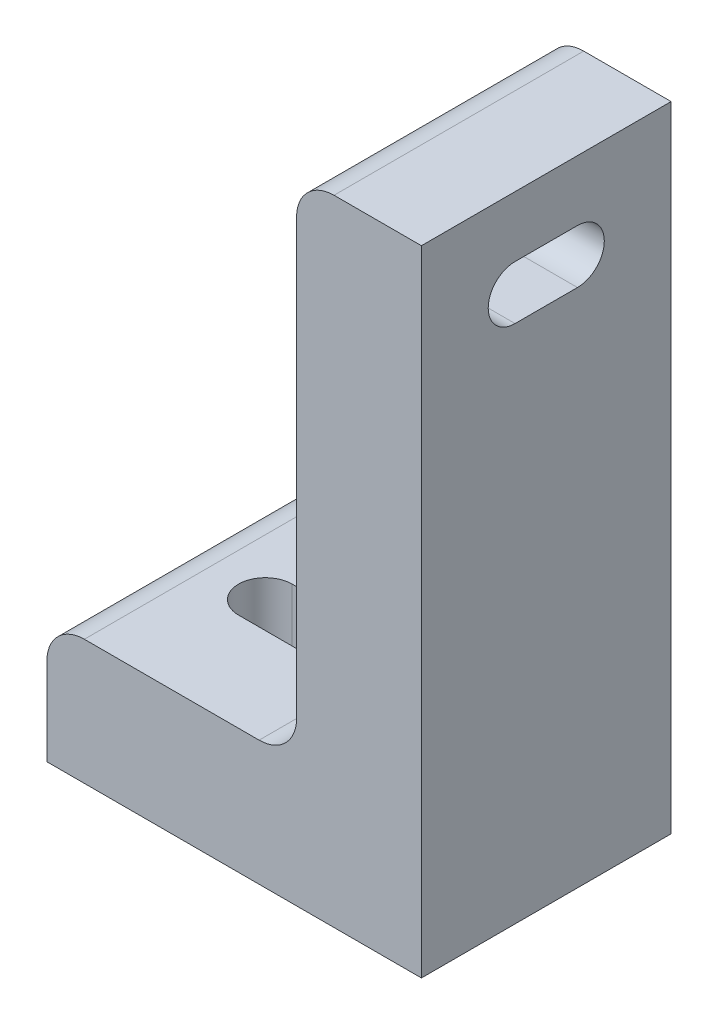
ISO-10303-21;
HEADER;
FILE_DESCRIPTION(('STEP AP214'),'2;1');
FILE_NAME('part.step','',(''),(''),'','','');
FILE_SCHEMA(('AUTOMOTIVE_DESIGN { 1 0 10303 214 1 1 1 1 }'));
ENDSEC;
DATA;
#1=APPLICATION_CONTEXT('core data for automotive mechanical design processes');
#2=APPLICATION_PROTOCOL_DEFINITION('international standard','automotive_design',2000,#1);
#3=PRODUCT_CONTEXT('',#1,'mechanical');
#4=PRODUCT('Part','Part','',(#3));
#5=PRODUCT_RELATED_PRODUCT_CATEGORY('part','',(#4));
#6=PRODUCT_DEFINITION_FORMATION('','',#4);
#7=PRODUCT_DEFINITION_CONTEXT('part definition',#1,'design');
#8=PRODUCT_DEFINITION('design','',#6,#7);
#9=PRODUCT_DEFINITION_SHAPE('','',#8);
#10=(LENGTH_UNIT() NAMED_UNIT(*) SI_UNIT(.MILLI.,.METRE.));
#11=(NAMED_UNIT(*) PLANE_ANGLE_UNIT() SI_UNIT($,.RADIAN.));
#12=(NAMED_UNIT(*) SI_UNIT($,.STERADIAN.) SOLID_ANGLE_UNIT());
#13=UNCERTAINTY_MEASURE_WITH_UNIT(LENGTH_MEASURE(1.E-05),#10,'distance_accuracy_value','');
#14=(GEOMETRIC_REPRESENTATION_CONTEXT(3) GLOBAL_UNCERTAINTY_ASSIGNED_CONTEXT((#13)) GLOBAL_UNIT_ASSIGNED_CONTEXT((#10,
#11,#12)) REPRESENTATION_CONTEXT('',''));
#15=CARTESIAN_POINT('',(0.,0.,0.));
#16=DIRECTION('',(0.,0.,1.));
#17=DIRECTION('',(1.,0.,0.));
#18=AXIS2_PLACEMENT_3D('',#15,#16,#17);
#19=CARTESIAN_POINT('',(0.,0.,20.));
#20=DIRECTION('',(-1.,0.,0.));
#21=DIRECTION('',(0.,0.,1.));
#22=AXIS2_PLACEMENT_3D('',#19,#20,#21);
#23=PLANE('',#22);
#24=DIRECTION('',(0.,1.,0.));
#25=VECTOR('',#24,1.);
#26=CARTESIAN_POINT('',(0.,0.,0.));
#27=LINE('',#26,#25);
#28=CARTESIAN_POINT('',(0.,0.,0.));
#29=VERTEX_POINT('',#28);
#30=CARTESIAN_POINT('',(0.,50.8,0.));
#31=VERTEX_POINT('',#30);
#32=EDGE_CURVE('E394',#29,#31,#27,.T.);
#33=ORIENTED_EDGE('',*,*,#32,.T.);
#34=DIRECTION('',(0.,0.,-1.));
#35=VECTOR('',#34,1.);
#36=CARTESIAN_POINT('',(0.,50.8,20.));
#37=LINE('',#36,#35);
#38=CARTESIAN_POINT('',(0.,50.8,20.));
#39=VERTEX_POINT('',#38);
#40=EDGE_CURVE('E387',#39,#31,#37,.T.);
#41=ORIENTED_EDGE('',*,*,#40,.F.);
#42=DIRECTION('',(0.,1.,0.));
#43=VECTOR('',#42,1.);
#44=CARTESIAN_POINT('',(0.,0.,20.));
#45=LINE('',#44,#43);
#46=CARTESIAN_POINT('',(0.,0.,20.));
#47=VERTEX_POINT('',#46);
#48=EDGE_CURVE('E379',#47,#39,#45,.T.);
#49=ORIENTED_EDGE('',*,*,#48,.F.);
#50=DIRECTION('',(0.,0.,-1.));
#51=VECTOR('',#50,1.);
#52=CARTESIAN_POINT('',(0.,0.,20.));
#53=LINE('',#52,#51);
#54=EDGE_CURVE('E403',#47,#29,#53,.T.);
#55=ORIENTED_EDGE('',*,*,#54,.T.);
#56=EDGE_LOOP('',(#33,#41,#49,#55));
#57=FACE_BOUND('',#56,.T.);
#58=DIRECTION('',(0.,0.,1.));
#59=VECTOR('',#58,1.);
#60=CARTESIAN_POINT('',(0.,45.95,20.));
#61=LINE('',#60,#59);
#62=CARTESIAN_POINT('',(0.,45.95,7.5));
#63=VERTEX_POINT('',#62);
#64=CARTESIAN_POINT('',(0.,45.95,12.5));
#65=VERTEX_POINT('',#64);
#66=EDGE_CURVE('E414',#63,#65,#61,.T.);
#67=ORIENTED_EDGE('',*,*,#66,.F.);
#68=CARTESIAN_POINT('',(0.,43.8,7.5));
#69=DIRECTION('',(-1.,0.,0.));
#70=DIRECTION('',(0.,0.,1.));
#71=AXIS2_PLACEMENT_3D('',#68,#69,#70);
#72=CIRCLE('',#71,2.15);
#73=CARTESIAN_POINT('',(0.,41.65,7.5));
#74=VERTEX_POINT('',#73);
#75=EDGE_CURVE('E411',#63,#74,#72,.T.);
#76=ORIENTED_EDGE('',*,*,#75,.T.);
#77=DIRECTION('',(0.,0.,1.));
#78=VECTOR('',#77,1.);
#79=CARTESIAN_POINT('',(0.,41.65,20.));
#80=LINE('',#79,#78);
#81=CARTESIAN_POINT('',(0.,41.65,12.5));
#82=VERTEX_POINT('',#81);
#83=EDGE_CURVE('E408',#74,#82,#80,.T.);
#84=ORIENTED_EDGE('',*,*,#83,.T.);
#85=CARTESIAN_POINT('',(0.,43.8,12.5));
#86=DIRECTION('',(-1.,0.,0.));
#87=DIRECTION('',(0.,0.,1.));
#88=AXIS2_PLACEMENT_3D('',#85,#86,#87);
#89=CIRCLE('',#88,2.15);
#90=EDGE_CURVE('E368',#82,#65,#89,.T.);
#91=ORIENTED_EDGE('',*,*,#90,.T.);
#92=EDGE_LOOP('',(#67,#76,#84,#91));
#93=FACE_BOUND('',#92,.T.);
#94=ADVANCED_FACE('F191',(#57,#93),#23,.F.);
#95=CARTESIAN_POINT('',(-10.,10.,20.));
#96=DIRECTION('',(0.,-1.,0.));
#97=DIRECTION('',(1.,0.,0.));
#98=AXIS2_PLACEMENT_3D('',#95,#96,#97);
#99=PLANE('',#98);
#100=CARTESIAN_POINT('',(-22.5,10.,10.));
#101=DIRECTION('',(0.,1.,0.));
#102=DIRECTION('',(0.,0.,1.));
#103=AXIS2_PLACEMENT_3D('',#100,#101,#102);
#104=CIRCLE('',#103,2.14999999999999);
#105=CARTESIAN_POINT('',(-22.5,10.,7.85000000000001));
#106=VERTEX_POINT('',#105);
#107=CARTESIAN_POINT('',(-22.5,10.,12.15));
#108=VERTEX_POINT('',#107);
#109=EDGE_CURVE('E335',#106,#108,#104,.T.);
#110=ORIENTED_EDGE('',*,*,#109,.F.);
#111=DIRECTION('',(1.,0.,0.));
#112=VECTOR('',#111,1.);
#113=CARTESIAN_POINT('',(-22.5,10.,7.85000000000001));
#114=LINE('',#113,#112);
#115=CARTESIAN_POINT('',(-17.5,10.,7.85000000000001));
#116=VERTEX_POINT('',#115);
#117=EDGE_CURVE('E316',#106,#116,#114,.T.);
#118=ORIENTED_EDGE('',*,*,#117,.T.);
#119=CARTESIAN_POINT('',(-17.5,10.,10.));
#120=DIRECTION('',(0.,1.,0.));
#121=DIRECTION('',(0.,0.,1.));
#122=AXIS2_PLACEMENT_3D('',#119,#120,#121);
#123=CIRCLE('',#122,2.14999999999999);
#124=CARTESIAN_POINT('',(-17.5,10.,12.15));
#125=VERTEX_POINT('',#124);
#126=EDGE_CURVE('E323',#125,#116,#123,.T.);
#127=ORIENTED_EDGE('',*,*,#126,.F.);
#128=DIRECTION('',(1.,0.,0.));
#129=VECTOR('',#128,1.);
#130=CARTESIAN_POINT('',(-22.5,10.,12.15));
#131=LINE('',#130,#129);
#132=EDGE_CURVE('E336',#108,#125,#131,.T.);
#133=ORIENTED_EDGE('',*,*,#132,.F.);
#134=EDGE_LOOP('',(#110,#118,#127,#133));
#135=FACE_BOUND('',#134,.T.);
#136=DIRECTION('',(-1.,0.,0.));
#137=VECTOR('',#136,1.);
#138=CARTESIAN_POINT('',(-10.,10.,20.));
#139=LINE('',#138,#137);
#140=CARTESIAN_POINT('',(-13.,10.,20.));
#141=VERTEX_POINT('',#140);
#142=CARTESIAN_POINT('',(-27.,10.,20.));
#143=VERTEX_POINT('',#142);
#144=EDGE_CURVE('E372',#141,#143,#139,.T.);
#145=ORIENTED_EDGE('',*,*,#144,.F.);
#146=DIRECTION('',(0.,0.,-1.));
#147=VECTOR('',#146,1.);
#148=CARTESIAN_POINT('',(-13.,10.,20.));
#149=LINE('',#148,#147);
#150=CARTESIAN_POINT('',(-13.,10.,0.));
#151=VERTEX_POINT('',#150);
#152=EDGE_CURVE('E437',#141,#151,#149,.T.);
#153=ORIENTED_EDGE('',*,*,#152,.T.);
#154=DIRECTION('',(-1.,0.,0.));
#155=VECTOR('',#154,1.);
#156=CARTESIAN_POINT('',(-10.,10.,0.));
#157=LINE('',#156,#155);
#158=CARTESIAN_POINT('',(-27.,10.,0.));
#159=VERTEX_POINT('',#158);
#160=EDGE_CURVE('E371',#151,#159,#157,.T.);
#161=ORIENTED_EDGE('',*,*,#160,.T.);
#162=DIRECTION('',(0.,0.,-1.));
#163=VECTOR('',#162,1.);
#164=CARTESIAN_POINT('',(-27.,10.,20.));
#165=LINE('',#164,#163);
#166=EDGE_CURVE('E214',#159,#143,#165,.F.);
#167=ORIENTED_EDGE('',*,*,#166,.T.);
#168=EDGE_LOOP('',(#145,#153,#161,#167));
#169=FACE_BOUND('',#168,.T.);
#170=ADVANCED_FACE('F333',(#135,#169),#99,.F.);
#171=CARTESIAN_POINT('',(-30.,0.,20.));
#172=DIRECTION('',(-1.,0.,0.));
#173=DIRECTION('',(0.,0.,1.));
#174=AXIS2_PLACEMENT_3D('',#171,#172,#173);
#175=PLANE('',#174);
#176=DIRECTION('',(0.,1.,0.));
#177=VECTOR('',#176,1.);
#178=CARTESIAN_POINT('',(-30.,0.,20.));
#179=LINE('',#178,#177);
#180=CARTESIAN_POINT('',(-30.,0.,20.));
#181=VERTEX_POINT('',#180);
#182=CARTESIAN_POINT('',(-30.,7.,20.));
#183=VERTEX_POINT('',#182);
#184=EDGE_CURVE('E374',#181,#183,#179,.T.);
#185=ORIENTED_EDGE('',*,*,#184,.T.);
#186=DIRECTION('',(0.,0.,-1.));
#187=VECTOR('',#186,1.);
#188=CARTESIAN_POINT('',(-30.,7.,0.));
#189=LINE('',#188,#187);
#190=CARTESIAN_POINT('',(-30.,7.,0.));
#191=VERTEX_POINT('',#190);
#192=EDGE_CURVE('E440',#183,#191,#189,.T.);
#193=ORIENTED_EDGE('',*,*,#192,.T.);
#194=DIRECTION('',(0.,1.,0.));
#195=VECTOR('',#194,1.);
#196=CARTESIAN_POINT('',(-30.,0.,0.));
#197=LINE('',#196,#195);
#198=CARTESIAN_POINT('',(-30.,0.,0.));
#199=VERTEX_POINT('',#198);
#200=EDGE_CURVE('E389',#199,#191,#197,.T.);
#201=ORIENTED_EDGE('',*,*,#200,.F.);
#202=DIRECTION('',(0.,0.,-1.));
#203=VECTOR('',#202,1.);
#204=CARTESIAN_POINT('',(-30.,0.,20.));
#205=LINE('',#204,#203);
#206=EDGE_CURVE('E406',#181,#199,#205,.T.);
#207=ORIENTED_EDGE('',*,*,#206,.F.);
#208=EDGE_LOOP('',(#185,#193,#201,#207));
#209=FACE_BOUND('',#208,.T.);
#210=ADVANCED_FACE('F461',(#209),#175,.T.);
#211=CARTESIAN_POINT('',(-30.,0.,20.));
#212=DIRECTION('',(0.,1.,0.));
#213=DIRECTION('',(0.,0.,1.));
#214=AXIS2_PLACEMENT_3D('',#211,#212,#213);
#215=PLANE('',#214);
#216=DIRECTION('',(1.,0.,0.));
#217=VECTOR('',#216,1.);
#218=CARTESIAN_POINT('',(-30.,0.,12.15));
#219=LINE('',#218,#217);
#220=CARTESIAN_POINT('',(-22.5,0.,12.15));
#221=VERTEX_POINT('',#220);
#222=CARTESIAN_POINT('',(-17.5,0.,12.15));
#223=VERTEX_POINT('',#222);
#224=EDGE_CURVE('E417',#221,#223,#219,.T.);
#225=ORIENTED_EDGE('',*,*,#224,.T.);
#226=CARTESIAN_POINT('',(-17.5,0.,10.));
#227=DIRECTION('',(0.,1.,0.));
#228=DIRECTION('',(0.,0.,1.));
#229=AXIS2_PLACEMENT_3D('',#226,#227,#228);
#230=CIRCLE('',#229,2.14999999999999);
#231=CARTESIAN_POINT('',(-17.5,0.,7.85000000000001));
#232=VERTEX_POINT('',#231);
#233=EDGE_CURVE('E420',#223,#232,#230,.T.);
#234=ORIENTED_EDGE('',*,*,#233,.T.);
#235=DIRECTION('',(-1.,0.,0.));
#236=VECTOR('',#235,1.);
#237=CARTESIAN_POINT('',(-30.,0.,7.85000000000002));
#238=LINE('',#237,#236);
#239=CARTESIAN_POINT('',(-22.5,0.,7.85000000000001));
#240=VERTEX_POINT('',#239);
#241=EDGE_CURVE('E319',#232,#240,#238,.T.);
#242=ORIENTED_EDGE('',*,*,#241,.T.);
#243=CARTESIAN_POINT('',(-22.5,0.,10.));
#244=DIRECTION('',(0.,1.,0.));
#245=DIRECTION('',(0.,0.,1.));
#246=AXIS2_PLACEMENT_3D('',#243,#244,#245);
#247=CIRCLE('',#246,2.14999999999999);
#248=EDGE_CURVE('E345',#240,#221,#247,.T.);
#249=ORIENTED_EDGE('',*,*,#248,.T.);
#250=EDGE_LOOP('',(#225,#234,#242,#249));
#251=FACE_BOUND('',#250,.T.);
#252=DIRECTION('',(1.,0.,0.));
#253=VECTOR('',#252,1.);
#254=CARTESIAN_POINT('',(-30.,0.,0.));
#255=LINE('',#254,#253);
#256=EDGE_CURVE('E392',#199,#29,#255,.T.);
#257=ORIENTED_EDGE('',*,*,#256,.T.);
#258=ORIENTED_EDGE('',*,*,#54,.F.);
#259=DIRECTION('',(1.,0.,0.));
#260=VECTOR('',#259,1.);
#261=CARTESIAN_POINT('',(-30.,0.,20.));
#262=LINE('',#261,#260);
#263=EDGE_CURVE('E377',#181,#47,#262,.T.);
#264=ORIENTED_EDGE('',*,*,#263,.F.);
#265=ORIENTED_EDGE('',*,*,#206,.T.);
#266=EDGE_LOOP('',(#257,#258,#264,#265));
#267=FACE_BOUND('',#266,.T.);
#268=ADVANCED_FACE('F466',(#251,#267),#215,.F.);
#269=CARTESIAN_POINT('',(-10.,50.8,20.));
#270=DIRECTION('',(0.,1.,0.));
#271=DIRECTION('',(0.,0.,1.));
#272=AXIS2_PLACEMENT_3D('',#269,#270,#271);
#273=PLANE('',#272);
#274=DIRECTION('',(1.,0.,0.));
#275=VECTOR('',#274,1.);
#276=CARTESIAN_POINT('',(-10.,50.8,0.));
#277=LINE('',#276,#275);
#278=CARTESIAN_POINT('',(-7.,50.8,0.));
#279=VERTEX_POINT('',#278);
#280=EDGE_CURVE('E397',#279,#31,#277,.T.);
#281=ORIENTED_EDGE('',*,*,#280,.F.);
#282=DIRECTION('',(0.,0.,-1.));
#283=VECTOR('',#282,1.);
#284=CARTESIAN_POINT('',(-7.,50.8,20.));
#285=LINE('',#284,#283);
#286=CARTESIAN_POINT('',(-7.,50.8,20.));
#287=VERTEX_POINT('',#286);
#288=EDGE_CURVE('E431',#279,#287,#285,.F.);
#289=ORIENTED_EDGE('',*,*,#288,.T.);
#290=DIRECTION('',(1.,0.,0.));
#291=VECTOR('',#290,1.);
#292=CARTESIAN_POINT('',(-10.,50.8,20.));
#293=LINE('',#292,#291);
#294=EDGE_CURVE('E382',#287,#39,#293,.T.);
#295=ORIENTED_EDGE('',*,*,#294,.T.);
#296=ORIENTED_EDGE('',*,*,#40,.T.);
#297=EDGE_LOOP('',(#281,#289,#295,#296));
#298=FACE_BOUND('',#297,.T.);
#299=ADVANCED_FACE('F478',(#298),#273,.T.);
#300=CARTESIAN_POINT('',(-10.,10.,20.));
#301=DIRECTION('',(-1.,0.,0.));
#302=DIRECTION('',(0.,0.,1.));
#303=AXIS2_PLACEMENT_3D('',#300,#301,#302);
#304=PLANE('',#303);
#305=DIRECTION('',(0.,0.,1.));
#306=VECTOR('',#305,1.);
#307=CARTESIAN_POINT('',(-10.,41.65,7.5));
#308=LINE('',#307,#306);
#309=CARTESIAN_POINT('',(-10.,41.65,7.5));
#310=VERTEX_POINT('',#309);
#311=CARTESIAN_POINT('',(-10.,41.65,12.5));
#312=VERTEX_POINT('',#311);
#313=EDGE_CURVE('E348',#310,#312,#308,.T.);
#314=ORIENTED_EDGE('',*,*,#313,.F.);
#315=CARTESIAN_POINT('',(-10.,43.8,7.5));
#316=DIRECTION('',(-1.,0.,0.));
#317=DIRECTION('',(0.,0.,1.));
#318=AXIS2_PLACEMENT_3D('',#315,#316,#317);
#319=CIRCLE('',#318,2.15);
#320=CARTESIAN_POINT('',(-10.,45.95,7.5));
#321=VERTEX_POINT('',#320);
#322=EDGE_CURVE('E356',#321,#310,#319,.T.);
#323=ORIENTED_EDGE('',*,*,#322,.F.);
#324=DIRECTION('',(0.,0.,1.));
#325=VECTOR('',#324,1.);
#326=CARTESIAN_POINT('',(-10.,45.95,7.5));
#327=LINE('',#326,#325);
#328=CARTESIAN_POINT('',(-10.,45.95,12.5));
#329=VERTEX_POINT('',#328);
#330=EDGE_CURVE('E350',#321,#329,#327,.T.);
#331=ORIENTED_EDGE('',*,*,#330,.T.);
#332=CARTESIAN_POINT('',(-10.,43.8,12.5));
#333=DIRECTION('',(-1.,0.,0.));
#334=DIRECTION('',(0.,0.,1.));
#335=AXIS2_PLACEMENT_3D('',#332,#333,#334);
#336=CIRCLE('',#335,2.15);
#337=EDGE_CURVE('E364',#312,#329,#336,.T.);
#338=ORIENTED_EDGE('',*,*,#337,.F.);
#339=EDGE_LOOP('',(#314,#323,#331,#338));
#340=FACE_BOUND('',#339,.T.);
#341=DIRECTION('',(0.,1.,0.));
#342=VECTOR('',#341,1.);
#343=CARTESIAN_POINT('',(-10.,10.,20.));
#344=LINE('',#343,#342);
#345=CARTESIAN_POINT('',(-10.,13.,20.));
#346=VERTEX_POINT('',#345);
#347=CARTESIAN_POINT('',(-10.,47.8,20.));
#348=VERTEX_POINT('',#347);
#349=EDGE_CURVE('E384',#346,#348,#344,.T.);
#350=ORIENTED_EDGE('',*,*,#349,.T.);
#351=DIRECTION('',(0.,0.,-1.));
#352=VECTOR('',#351,1.);
#353=CARTESIAN_POINT('',(-10.,47.8,20.));
#354=LINE('',#353,#352);
#355=CARTESIAN_POINT('',(-10.,47.8,0.));
#356=VERTEX_POINT('',#355);
#357=EDGE_CURVE('E424',#348,#356,#354,.T.);
#358=ORIENTED_EDGE('',*,*,#357,.T.);
#359=DIRECTION('',(0.,1.,0.));
#360=VECTOR('',#359,1.);
#361=CARTESIAN_POINT('',(-10.,10.,0.));
#362=LINE('',#361,#360);
#363=CARTESIAN_POINT('',(-10.,13.,0.));
#364=VERTEX_POINT('',#363);
#365=EDGE_CURVE('E375',#364,#356,#362,.T.);
#366=ORIENTED_EDGE('',*,*,#365,.F.);
#367=DIRECTION('',(0.,0.,-1.));
#368=VECTOR('',#367,1.);
#369=CARTESIAN_POINT('',(-10.,13.,20.));
#370=LINE('',#369,#368);
#371=EDGE_CURVE('E422',#364,#346,#370,.F.);
#372=ORIENTED_EDGE('',*,*,#371,.T.);
#373=EDGE_LOOP('',(#350,#358,#366,#372));
#374=FACE_BOUND('',#373,.T.);
#375=ADVANCED_FACE('F450',(#340,#374),#304,.T.);
#376=CARTESIAN_POINT('',(0.,0.,20.));
#377=DIRECTION('',(0.,0.,-1.));
#378=DIRECTION('',(-1.,0.,0.));
#379=AXIS2_PLACEMENT_3D('',#376,#377,#378);
#380=PLANE('',#379);
#381=ORIENTED_EDGE('',*,*,#294,.F.);
#382=CARTESIAN_POINT('',(-7.,47.8,20.));
#383=DIRECTION('',(0.,0.,-1.));
#384=DIRECTION('',(-1.,0.,0.));
#385=AXIS2_PLACEMENT_3D('',#382,#383,#384);
#386=CIRCLE('',#385,3.);
#387=EDGE_CURVE('E434',#287,#348,#386,.F.);
#388=ORIENTED_EDGE('',*,*,#387,.T.);
#389=ORIENTED_EDGE('',*,*,#349,.F.);
#390=CARTESIAN_POINT('',(-13.,13.,20.));
#391=DIRECTION('',(0.,0.,-1.));
#392=DIRECTION('',(-1.,0.,0.));
#393=AXIS2_PLACEMENT_3D('',#390,#391,#392);
#394=CIRCLE('',#393,3.);
#395=EDGE_CURVE('E13',#346,#141,#394,.T.);
#396=ORIENTED_EDGE('',*,*,#395,.T.);
#397=ORIENTED_EDGE('',*,*,#144,.T.);
#398=CARTESIAN_POINT('',(-27.,7.,20.));
#399=DIRECTION('',(0.,0.,-1.));
#400=DIRECTION('',(-1.,0.,0.));
#401=AXIS2_PLACEMENT_3D('',#398,#399,#400);
#402=CIRCLE('',#401,3.);
#403=EDGE_CURVE('E206',#143,#183,#402,.F.);
#404=ORIENTED_EDGE('',*,*,#403,.T.);
#405=ORIENTED_EDGE('',*,*,#184,.F.);
#406=ORIENTED_EDGE('',*,*,#263,.T.);
#407=ORIENTED_EDGE('',*,*,#48,.T.);
#408=EDGE_LOOP('',(#381,#388,#389,#396,#397,#404,#405,#406,#407));
#409=FACE_BOUND('',#408,.T.);
#410=ADVANCED_FACE('F456',(#409),#380,.F.);
#411=CARTESIAN_POINT('',(0.,0.,0.));
#412=DIRECTION('',(0.,0.,-1.));
#413=DIRECTION('',(-1.,0.,0.));
#414=AXIS2_PLACEMENT_3D('',#411,#412,#413);
#415=PLANE('',#414);
#416=ORIENTED_EDGE('',*,*,#365,.T.);
#417=CARTESIAN_POINT('',(-7.,47.8,0.));
#418=DIRECTION('',(0.,0.,-1.));
#419=DIRECTION('',(-1.,0.,0.));
#420=AXIS2_PLACEMENT_3D('',#417,#418,#419);
#421=CIRCLE('',#420,3.);
#422=EDGE_CURVE('E429',#356,#279,#421,.T.);
#423=ORIENTED_EDGE('',*,*,#422,.T.);
#424=ORIENTED_EDGE('',*,*,#280,.T.);
#425=ORIENTED_EDGE('',*,*,#32,.F.);
#426=ORIENTED_EDGE('',*,*,#256,.F.);
#427=ORIENTED_EDGE('',*,*,#200,.T.);
#428=CARTESIAN_POINT('',(-27.,7.,0.));
#429=DIRECTION('',(0.,0.,-1.));
#430=DIRECTION('',(-1.,0.,0.));
#431=AXIS2_PLACEMENT_3D('',#428,#429,#430);
#432=CIRCLE('',#431,3.);
#433=EDGE_CURVE('E427',#191,#159,#432,.T.);
#434=ORIENTED_EDGE('',*,*,#433,.T.);
#435=ORIENTED_EDGE('',*,*,#160,.F.);
#436=CARTESIAN_POINT('',(-13.,13.,0.));
#437=DIRECTION('',(0.,0.,-1.));
#438=DIRECTION('',(-1.,0.,0.));
#439=AXIS2_PLACEMENT_3D('',#436,#437,#438);
#440=CIRCLE('',#439,3.);
#441=EDGE_CURVE('E199',#151,#364,#440,.F.);
#442=ORIENTED_EDGE('',*,*,#441,.T.);
#443=EDGE_LOOP('',(#416,#423,#424,#425,#426,#427,#434,#435,#442));
#444=FACE_BOUND('',#443,.T.);
#445=ADVANCED_FACE('F445',(#444),#415,.T.);
#446=CARTESIAN_POINT('',(14.5,45.95,7.5));
#447=DIRECTION('',(0.,-1.,0.));
#448=DIRECTION('',(1.,0.,0.));
#449=AXIS2_PLACEMENT_3D('',#446,#447,#448);
#450=PLANE('',#449);
#451=ORIENTED_EDGE('',*,*,#66,.T.);
#452=DIRECTION('',(1.,0.,0.));
#453=VECTOR('',#452,1.);
#454=CARTESIAN_POINT('',(14.5,45.95,12.5));
#455=LINE('',#454,#453);
#456=EDGE_CURVE('E361',#329,#65,#455,.T.);
#457=ORIENTED_EDGE('',*,*,#456,.F.);
#458=ORIENTED_EDGE('',*,*,#330,.F.);
#459=DIRECTION('',(1.,0.,0.));
#460=VECTOR('',#459,1.);
#461=CARTESIAN_POINT('',(14.5,45.95,7.5));
#462=LINE('',#461,#460);
#463=EDGE_CURVE('E353',#321,#63,#462,.T.);
#464=ORIENTED_EDGE('',*,*,#463,.T.);
#465=EDGE_LOOP('',(#451,#457,#458,#464));
#466=FACE_BOUND('',#465,.T.);
#467=ADVANCED_FACE('F584',(#466),#450,.T.);
#468=CARTESIAN_POINT('',(-10.,43.8,7.5));
#469=DIRECTION('',(-1.,0.,0.));
#470=DIRECTION('',(0.,0.,1.));
#471=AXIS2_PLACEMENT_3D('',#468,#469,#470);
#472=CYLINDRICAL_SURFACE('',#471,2.15);
#473=ORIENTED_EDGE('',*,*,#463,.F.);
#474=ORIENTED_EDGE('',*,*,#322,.T.);
#475=DIRECTION('',(-1.,0.,0.));
#476=VECTOR('',#475,1.);
#477=CARTESIAN_POINT('',(-10.,41.65,7.5));
#478=LINE('',#477,#476);
#479=EDGE_CURVE('E359',#74,#310,#478,.T.);
#480=ORIENTED_EDGE('',*,*,#479,.F.);
#481=ORIENTED_EDGE('',*,*,#75,.F.);
#482=EDGE_LOOP('',(#473,#474,#480,#481));
#483=FACE_BOUND('',#482,.T.);
#484=ADVANCED_FACE('F574',(#483),#472,.F.);
#485=CARTESIAN_POINT('',(-10.,41.65,7.5));
#486=DIRECTION('',(0.,-1.,0.));
#487=DIRECTION('',(0.,0.,-1.));
#488=AXIS2_PLACEMENT_3D('',#485,#486,#487);
#489=PLANE('',#488);
#490=ORIENTED_EDGE('',*,*,#479,.T.);
#491=ORIENTED_EDGE('',*,*,#313,.T.);
#492=DIRECTION('',(-1.,0.,0.));
#493=VECTOR('',#492,1.);
#494=CARTESIAN_POINT('',(-10.,41.65,12.5));
#495=LINE('',#494,#493);
#496=EDGE_CURVE('E366',#312,#82,#495,.F.);
#497=ORIENTED_EDGE('',*,*,#496,.T.);
#498=ORIENTED_EDGE('',*,*,#83,.F.);
#499=EDGE_LOOP('',(#490,#491,#497,#498));
#500=FACE_BOUND('',#499,.T.);
#501=ADVANCED_FACE('F564',(#500),#489,.F.);
#502=CARTESIAN_POINT('',(-10.,43.8,12.5));
#503=DIRECTION('',(-1.,0.,0.));
#504=DIRECTION('',(0.,0.,1.));
#505=AXIS2_PLACEMENT_3D('',#502,#503,#504);
#506=CYLINDRICAL_SURFACE('',#505,2.15);
#507=ORIENTED_EDGE('',*,*,#496,.F.);
#508=ORIENTED_EDGE('',*,*,#337,.T.);
#509=ORIENTED_EDGE('',*,*,#456,.T.);
#510=ORIENTED_EDGE('',*,*,#90,.F.);
#511=EDGE_LOOP('',(#507,#508,#509,#510));
#512=FACE_BOUND('',#511,.T.);
#513=ADVANCED_FACE('F555',(#512),#506,.F.);
#514=CARTESIAN_POINT('',(-17.5,10.,10.));
#515=DIRECTION('',(0.,1.,0.));
#516=DIRECTION('',(0.,0.,1.));
#517=AXIS2_PLACEMENT_3D('',#514,#515,#516);
#518=CYLINDRICAL_SURFACE('',#517,2.14999999999999);
#519=DIRECTION('',(0.,1.,0.));
#520=VECTOR('',#519,1.);
#521=CARTESIAN_POINT('',(-17.5,10.,12.15));
#522=LINE('',#521,#520);
#523=EDGE_CURVE('E322',#125,#223,#522,.F.);
#524=ORIENTED_EDGE('',*,*,#523,.F.);
#525=ORIENTED_EDGE('',*,*,#126,.T.);
#526=DIRECTION('',(0.,1.,0.));
#527=VECTOR('',#526,1.);
#528=CARTESIAN_POINT('',(-17.5,10.,7.85000000000001));
#529=LINE('',#528,#527);
#530=EDGE_CURVE('E312',#232,#116,#529,.T.);
#531=ORIENTED_EDGE('',*,*,#530,.F.);
#532=ORIENTED_EDGE('',*,*,#233,.F.);
#533=EDGE_LOOP('',(#524,#525,#531,#532));
#534=FACE_BOUND('',#533,.T.);
#535=ADVANCED_FACE('F327',(#534),#518,.F.);
#536=CARTESIAN_POINT('',(-22.5,10.,12.15));
#537=DIRECTION('',(0.,0.,1.));
#538=DIRECTION('',(1.,0.,0.));
#539=AXIS2_PLACEMENT_3D('',#536,#537,#538);
#540=PLANE('',#539);
#541=DIRECTION('',(0.,1.,0.));
#542=VECTOR('',#541,1.);
#543=CARTESIAN_POINT('',(-22.5,10.,12.15));
#544=LINE('',#543,#542);
#545=EDGE_CURVE('E338',#221,#108,#544,.T.);
#546=ORIENTED_EDGE('',*,*,#545,.T.);
#547=ORIENTED_EDGE('',*,*,#132,.T.);
#548=ORIENTED_EDGE('',*,*,#523,.T.);
#549=ORIENTED_EDGE('',*,*,#224,.F.);
#550=EDGE_LOOP('',(#546,#547,#548,#549));
#551=FACE_BOUND('',#550,.T.);
#552=ADVANCED_FACE('F537',(#551),#540,.F.);
#553=CARTESIAN_POINT('',(-22.5,10.,7.85000000000001));
#554=DIRECTION('',(0.,0.,-1.));
#555=DIRECTION('',(-1.,0.,0.));
#556=AXIS2_PLACEMENT_3D('',#553,#554,#555);
#557=PLANE('',#556);
#558=ORIENTED_EDGE('',*,*,#530,.T.);
#559=ORIENTED_EDGE('',*,*,#117,.F.);
#560=DIRECTION('',(0.,1.,0.));
#561=VECTOR('',#560,1.);
#562=CARTESIAN_POINT('',(-22.5,10.,7.85000000000001));
#563=LINE('',#562,#561);
#564=EDGE_CURVE('E331',#106,#240,#563,.F.);
#565=ORIENTED_EDGE('',*,*,#564,.T.);
#566=ORIENTED_EDGE('',*,*,#241,.F.);
#567=EDGE_LOOP('',(#558,#559,#565,#566));
#568=FACE_BOUND('',#567,.T.);
#569=ADVANCED_FACE('F314',(#568),#557,.F.);
#570=CARTESIAN_POINT('',(-22.5,10.,10.));
#571=DIRECTION('',(0.,1.,0.));
#572=DIRECTION('',(0.,0.,1.));
#573=AXIS2_PLACEMENT_3D('',#570,#571,#572);
#574=CYLINDRICAL_SURFACE('',#573,2.14999999999999);
#575=ORIENTED_EDGE('',*,*,#564,.F.);
#576=ORIENTED_EDGE('',*,*,#109,.T.);
#577=ORIENTED_EDGE('',*,*,#545,.F.);
#578=ORIENTED_EDGE('',*,*,#248,.F.);
#579=EDGE_LOOP('',(#575,#576,#577,#578));
#580=FACE_BOUND('',#579,.T.);
#581=ADVANCED_FACE('F500',(#580),#574,.F.);
#582=CARTESIAN_POINT('',(-7.,47.8,20.));
#583=DIRECTION('',(0.,0.,-1.));
#584=DIRECTION('',(-1.,0.,0.));
#585=AXIS2_PLACEMENT_3D('',#582,#583,#584);
#586=CYLINDRICAL_SURFACE('',#585,3.);
#587=ORIENTED_EDGE('',*,*,#387,.F.);
#588=ORIENTED_EDGE('',*,*,#288,.F.);
#589=ORIENTED_EDGE('',*,*,#422,.F.);
#590=ORIENTED_EDGE('',*,*,#357,.F.);
#591=EDGE_LOOP('',(#587,#588,#589,#590));
#592=FACE_BOUND('',#591,.T.);
#593=ADVANCED_FACE('F476',(#592),#586,.T.);
#594=CARTESIAN_POINT('',(-13.,13.,20.));
#595=DIRECTION('',(0.,0.,-1.));
#596=DIRECTION('',(-1.,0.,0.));
#597=AXIS2_PLACEMENT_3D('',#594,#595,#596);
#598=CYLINDRICAL_SURFACE('',#597,3.);
#599=ORIENTED_EDGE('',*,*,#395,.F.);
#600=ORIENTED_EDGE('',*,*,#371,.F.);
#601=ORIENTED_EDGE('',*,*,#441,.F.);
#602=ORIENTED_EDGE('',*,*,#152,.F.);
#603=EDGE_LOOP('',(#599,#600,#601,#602));
#604=FACE_BOUND('',#603,.T.);
#605=ADVANCED_FACE('F454',(#604),#598,.F.);
#606=CARTESIAN_POINT('',(-27.,7.,20.));
#607=DIRECTION('',(0.,0.,1.));
#608=DIRECTION('',(1.,0.,0.));
#609=AXIS2_PLACEMENT_3D('',#606,#607,#608);
#610=CYLINDRICAL_SURFACE('',#609,3.);
#611=ORIENTED_EDGE('',*,*,#403,.F.);
#612=ORIENTED_EDGE('',*,*,#166,.F.);
#613=ORIENTED_EDGE('',*,*,#433,.F.);
#614=ORIENTED_EDGE('',*,*,#192,.F.);
#615=EDGE_LOOP('',(#611,#612,#613,#614));
#616=FACE_BOUND('',#615,.T.);
#617=ADVANCED_FACE('F193',(#616),#610,.T.);
#618=CLOSED_SHELL('',(#94,#170,#210,#268,#299,#375,#410,#445,#467,#484,#501,#513,#535,#552,#569,
#581,#593,#605,#617));
#619=MANIFOLD_SOLID_BREP('B2',#618);
#620=ADVANCED_BREP_SHAPE_REPRESENTATION('',(#18,#619),#14);
#621=SHAPE_DEFINITION_REPRESENTATION(#9,#620);
ENDSEC;
END-ISO-10303-21;
